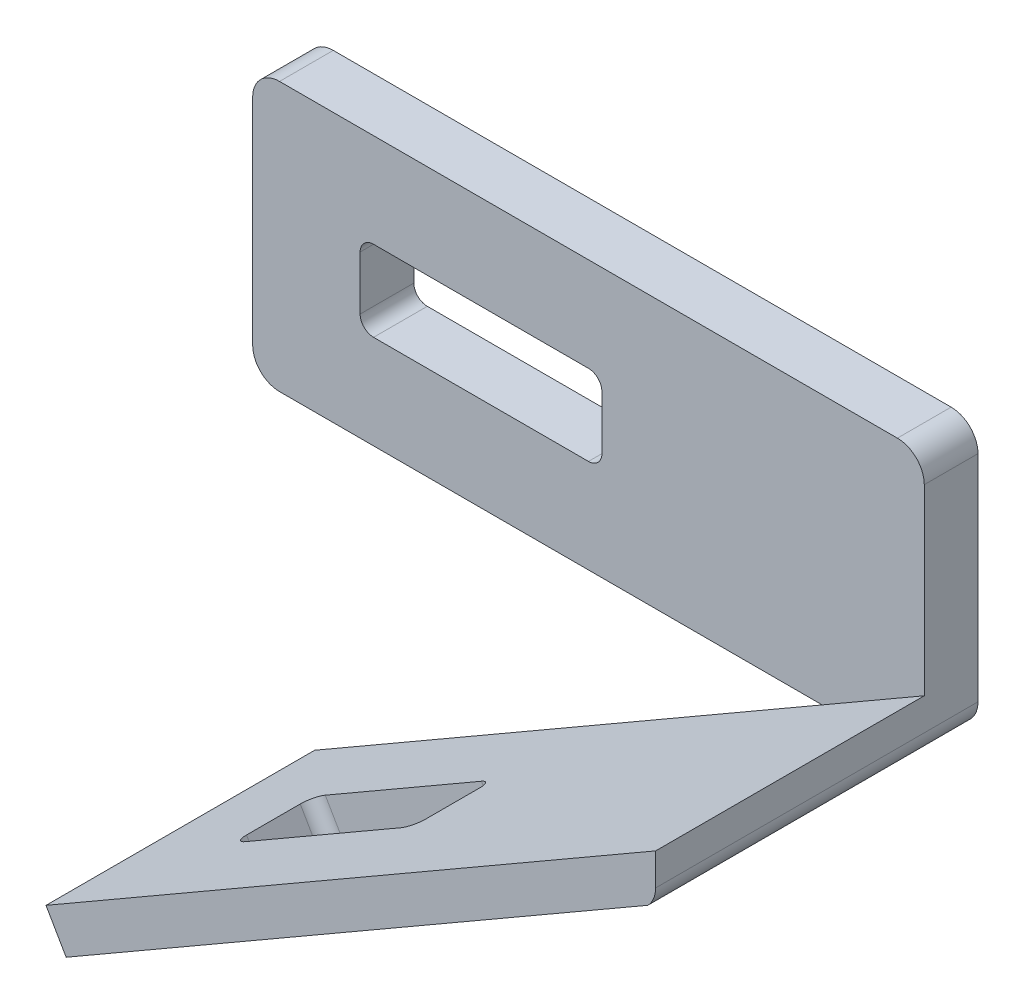
ISO-10303-21;
HEADER;
FILE_DESCRIPTION(('STEP AP214'),'2;1');
FILE_NAME('part.step','',(''),(''),'','','');
FILE_SCHEMA(('AUTOMOTIVE_DESIGN { 1 0 10303 214 1 1 1 1 }'));
ENDSEC;
DATA;
#1=APPLICATION_CONTEXT('core data for automotive mechanical design processes');
#2=APPLICATION_PROTOCOL_DEFINITION('international standard','automotive_design',2000,#1);
#3=PRODUCT_CONTEXT('',#1,'mechanical');
#4=PRODUCT('Part','Part','',(#3));
#5=PRODUCT_RELATED_PRODUCT_CATEGORY('part','',(#4));
#6=PRODUCT_DEFINITION_FORMATION('','',#4);
#7=PRODUCT_DEFINITION_CONTEXT('part definition',#1,'design');
#8=PRODUCT_DEFINITION('design','',#6,#7);
#9=PRODUCT_DEFINITION_SHAPE('','',#8);
#10=(LENGTH_UNIT() NAMED_UNIT(*) SI_UNIT(.MILLI.,.METRE.));
#11=(NAMED_UNIT(*) PLANE_ANGLE_UNIT() SI_UNIT($,.RADIAN.));
#12=(NAMED_UNIT(*) SI_UNIT($,.STERADIAN.) SOLID_ANGLE_UNIT());
#13=UNCERTAINTY_MEASURE_WITH_UNIT(LENGTH_MEASURE(1.E-05),#10,'distance_accuracy_value','');
#14=(GEOMETRIC_REPRESENTATION_CONTEXT(3) GLOBAL_UNCERTAINTY_ASSIGNED_CONTEXT((#13)) GLOBAL_UNIT_ASSIGNED_CONTEXT((#10,
#11,#12)) REPRESENTATION_CONTEXT('',''));
#15=CARTESIAN_POINT('',(0.,0.,0.));
#16=DIRECTION('',(0.,0.,1.));
#17=DIRECTION('',(1.,0.,0.));
#18=AXIS2_PLACEMENT_3D('',#15,#16,#17);
#19=CARTESIAN_POINT('',(34.7267267267267,6.70870870870871,4.));
#20=DIRECTION('',(0.,0.,-1.));
#21=DIRECTION('',(-1.,0.,0.));
#22=AXIS2_PLACEMENT_3D('',#19,#20,#21);
#23=PLANE('',#22);
#24=DIRECTION('',(0.,-1.,0.));
#25=VECTOR('',#24,1.);
#26=CARTESIAN_POINT('',(-5.27327327327327,0.708708708708703,4.));
#27=LINE('',#26,#25);
#28=CARTESIAN_POINT('',(-5.27327327327327,0.708708708708703,4.));
#29=VERTEX_POINT('',#28);
#30=CARTESIAN_POINT('',(-5.27327327327327,-3.29129129129128,4.));
#31=VERTEX_POINT('',#30);
#32=EDGE_CURVE('E318',#29,#31,#27,.T.);
#33=ORIENTED_EDGE('',*,*,#32,.F.);
#34=CARTESIAN_POINT('',(-4.27327327327327,0.708708708708711,4.));
#35=DIRECTION('',(0.,0.,1.));
#36=DIRECTION('',(-1.,0.,0.));
#37=AXIS2_PLACEMENT_3D('',#34,#35,#36);
#38=CIRCLE('',#37,1.);
#39=CARTESIAN_POINT('',(-4.27327327327327,1.70870870870871,4.));
#40=VERTEX_POINT('',#39);
#41=EDGE_CURVE('E316',#40,#29,#38,.T.);
#42=ORIENTED_EDGE('',*,*,#41,.F.);
#43=DIRECTION('',(-1.,0.,0.));
#44=VECTOR('',#43,1.);
#45=CARTESIAN_POINT('',(-4.27327327327327,1.70870870870871,4.));
#46=LINE('',#45,#44);
#47=CARTESIAN_POINT('',(11.7267267267267,1.70870870870871,4.));
#48=VERTEX_POINT('',#47);
#49=EDGE_CURVE('E336',#48,#40,#46,.T.);
#50=ORIENTED_EDGE('',*,*,#49,.F.);
#51=CARTESIAN_POINT('',(11.7267267267267,0.708708708708711,4.));
#52=DIRECTION('',(0.,0.,1.));
#53=DIRECTION('',(1.,0.,0.));
#54=AXIS2_PLACEMENT_3D('',#51,#52,#53);
#55=CIRCLE('',#54,1.);
#56=CARTESIAN_POINT('',(12.7267267267267,0.708708708708703,4.));
#57=VERTEX_POINT('',#56);
#58=EDGE_CURVE('E333',#57,#48,#55,.T.);
#59=ORIENTED_EDGE('',*,*,#58,.F.);
#60=DIRECTION('',(0.,1.,0.));
#61=VECTOR('',#60,1.);
#62=CARTESIAN_POINT('',(12.7267267267267,0.708708708708703,4.));
#63=LINE('',#62,#61);
#64=CARTESIAN_POINT('',(12.7267267267267,-3.29129129129129,4.));
#65=VERTEX_POINT('',#64);
#66=EDGE_CURVE('E330',#65,#57,#63,.T.);
#67=ORIENTED_EDGE('',*,*,#66,.F.);
#68=CARTESIAN_POINT('',(11.7267267267267,-3.29129129129129,4.));
#69=DIRECTION('',(0.,0.,1.));
#70=DIRECTION('',(1.,0.,0.));
#71=AXIS2_PLACEMENT_3D('',#68,#69,#70);
#72=CIRCLE('',#71,1.);
#73=CARTESIAN_POINT('',(11.7267267267267,-4.29129129129129,4.));
#74=VERTEX_POINT('',#73);
#75=EDGE_CURVE('E327',#74,#65,#72,.T.);
#76=ORIENTED_EDGE('',*,*,#75,.F.);
#77=DIRECTION('',(1.,0.,0.));
#78=VECTOR('',#77,1.);
#79=CARTESIAN_POINT('',(-4.27327327327327,-4.29129129129129,4.));
#80=LINE('',#79,#78);
#81=CARTESIAN_POINT('',(-4.27327327327327,-4.29129129129129,4.));
#82=VERTEX_POINT('',#81);
#83=EDGE_CURVE('E324',#82,#74,#80,.T.);
#84=ORIENTED_EDGE('',*,*,#83,.F.);
#85=CARTESIAN_POINT('',(-4.27327327327327,-3.29129129129129,4.));
#86=DIRECTION('',(0.,0.,1.));
#87=DIRECTION('',(1.,0.,0.));
#88=AXIS2_PLACEMENT_3D('',#85,#86,#87);
#89=CIRCLE('',#88,1.);
#90=EDGE_CURVE('E321',#31,#82,#89,.T.);
#91=ORIENTED_EDGE('',*,*,#90,.F.);
#92=EDGE_LOOP('',(#33,#42,#50,#59,#67,#76,#84,#91));
#93=FACE_BOUND('',#92,.T.);
#94=DIRECTION('',(-0.866022860763139,-0.500004404616229,0.));
#95=VECTOR('',#94,1.);
#96=CARTESIAN_POINT('',(-8.65940989064749,-33.1068499702216,4.));
#97=LINE('',#96,#95);
#98=CARTESIAN_POINT('',(36.7267267267267,-6.9028439960563,4.));
#99=VERTEX_POINT('',#98);
#100=CARTESIAN_POINT('',(29.1258023231814,-11.2912912912913,4.));
#101=VERTEX_POINT('',#100);
#102=EDGE_CURVE('E289',#99,#101,#97,.T.);
#103=ORIENTED_EDGE('',*,*,#102,.F.);
#104=DIRECTION('',(0.,1.,0.));
#105=VECTOR('',#104,1.);
#106=CARTESIAN_POINT('',(36.7267267267267,6.70870870870871,4.));
#107=LINE('',#106,#105);
#108=CARTESIAN_POINT('',(36.7267267267267,6.70870870870871,4.));
#109=VERTEX_POINT('',#108);
#110=EDGE_CURVE('E377',#99,#109,#107,.T.);
#111=ORIENTED_EDGE('',*,*,#110,.T.);
#112=CARTESIAN_POINT('',(34.7267267267267,6.70870870870871,4.));
#113=DIRECTION('',(0.,0.,1.));
#114=DIRECTION('',(-1.,0.,0.));
#115=AXIS2_PLACEMENT_3D('',#112,#113,#114);
#116=CIRCLE('',#115,2.);
#117=CARTESIAN_POINT('',(34.7267267267267,8.70870870870871,4.));
#118=VERTEX_POINT('',#117);
#119=EDGE_CURVE('E357',#109,#118,#116,.T.);
#120=ORIENTED_EDGE('',*,*,#119,.T.);
#121=DIRECTION('',(-1.,0.,0.));
#122=VECTOR('',#121,1.);
#123=CARTESIAN_POINT('',(-11.2732732732733,8.70870870870871,4.));
#124=LINE('',#123,#122);
#125=CARTESIAN_POINT('',(-11.2732732732733,8.70870870870871,4.));
#126=VERTEX_POINT('',#125);
#127=EDGE_CURVE('E360',#118,#126,#124,.T.);
#128=ORIENTED_EDGE('',*,*,#127,.T.);
#129=CARTESIAN_POINT('',(-11.2732732732733,6.70870870870871,4.));
#130=DIRECTION('',(0.,0.,1.));
#131=DIRECTION('',(-1.,0.,0.));
#132=AXIS2_PLACEMENT_3D('',#129,#130,#131);
#133=CIRCLE('',#132,2.);
#134=CARTESIAN_POINT('',(-13.2732732732733,6.7087087087087,4.));
#135=VERTEX_POINT('',#134);
#136=EDGE_CURVE('E363',#126,#135,#133,.T.);
#137=ORIENTED_EDGE('',*,*,#136,.T.);
#138=DIRECTION('',(0.,-1.,0.));
#139=VECTOR('',#138,1.);
#140=CARTESIAN_POINT('',(-13.2732732732733,6.7087087087087,4.));
#141=LINE('',#140,#139);
#142=CARTESIAN_POINT('',(-13.2732732732733,-9.29129129129128,4.));
#143=VERTEX_POINT('',#142);
#144=EDGE_CURVE('E365',#135,#143,#141,.T.);
#145=ORIENTED_EDGE('',*,*,#144,.T.);
#146=CARTESIAN_POINT('',(-11.2732732732733,-9.29129129129129,4.));
#147=DIRECTION('',(0.,0.,1.));
#148=DIRECTION('',(-1.,0.,0.));
#149=AXIS2_PLACEMENT_3D('',#146,#147,#148);
#150=CIRCLE('',#149,2.);
#151=CARTESIAN_POINT('',(-11.2732732732733,-11.2912912912913,4.));
#152=VERTEX_POINT('',#151);
#153=EDGE_CURVE('E367',#143,#152,#150,.T.);
#154=ORIENTED_EDGE('',*,*,#153,.T.);
#155=DIRECTION('',(1.,0.,0.));
#156=VECTOR('',#155,1.);
#157=CARTESIAN_POINT('',(-11.2732732732733,-11.2912912912913,4.));
#158=LINE('',#157,#156);
#159=EDGE_CURVE('E370',#152,#101,#158,.T.);
#160=ORIENTED_EDGE('',*,*,#159,.T.);
#161=EDGE_LOOP('',(#103,#111,#120,#128,#137,#145,#154,#160));
#162=FACE_BOUND('',#161,.T.);
#163=ADVANCED_FACE('F33',(#93,#162),#23,.F.);
#164=DIRECTION('',(0.866022860763139,0.500004404616229,0.));
#165=VECTOR('',#164,1.);
#166=CARTESIAN_POINT('',(36.1417463613581,-10.7046983216996,4.));
#167=LINE('',#166,#165);
#168=CARTESIAN_POINT('',(35.2432829574773,-11.2234325026091,4.));
#169=VERTEX_POINT('',#168);
#170=CARTESIAN_POINT('',(36.1417463613581,-10.7046983216996,4.));
#171=VERTEX_POINT('',#170);
#172=EDGE_CURVE('E11',#169,#171,#167,.T.);
#173=ORIENTED_EDGE('',*,*,#172,.F.);
#174=CARTESIAN_POINT('',(34.7267267267267,-9.29129129129129,4.));
#175=DIRECTION('',(0.,0.,1.));
#176=DIRECTION('',(-1.,0.,0.));
#177=AXIS2_PLACEMENT_3D('',#174,#175,#176);
#178=CIRCLE('',#177,2.);
#179=EDGE_CURVE('E373',#169,#171,#178,.T.);
#180=ORIENTED_EDGE('',*,*,#179,.T.);
#181=EDGE_LOOP('',(#173,#180));
#182=FACE_BOUND('',#181,.T.);
#183=ADVANCED_FACE('F484',(#182),#23,.F.);
#184=CARTESIAN_POINT('',(34.7267267267267,6.70870870870871,4.));
#185=DIRECTION('',(0.,0.,-1.));
#186=DIRECTION('',(-1.,0.,0.));
#187=AXIS2_PLACEMENT_3D('',#184,#185,#186);
#188=CYLINDRICAL_SURFACE('',#187,2.);
#189=CARTESIAN_POINT('',(34.7267267267267,6.70870870870871,0.));
#190=DIRECTION('',(0.,0.,1.));
#191=DIRECTION('',(-1.,0.,0.));
#192=AXIS2_PLACEMENT_3D('',#189,#190,#191);
#193=CIRCLE('',#192,2.);
#194=CARTESIAN_POINT('',(36.7267267267267,6.70870870870871,0.));
#195=VERTEX_POINT('',#194);
#196=CARTESIAN_POINT('',(34.7267267267267,8.70870870870871,0.));
#197=VERTEX_POINT('',#196);
#198=EDGE_CURVE('E342',#195,#197,#193,.T.);
#199=ORIENTED_EDGE('',*,*,#198,.T.);
#200=DIRECTION('',(0.,0.,-1.));
#201=VECTOR('',#200,1.);
#202=CARTESIAN_POINT('',(34.7267267267267,8.70870870870871,4.));
#203=LINE('',#202,#201);
#204=EDGE_CURVE('E415',#118,#197,#203,.T.);
#205=ORIENTED_EDGE('',*,*,#204,.F.);
#206=ORIENTED_EDGE('',*,*,#119,.F.);
#207=DIRECTION('',(0.,0.,-1.));
#208=VECTOR('',#207,1.);
#209=CARTESIAN_POINT('',(36.7267267267267,6.70870870870871,4.));
#210=LINE('',#209,#208);
#211=EDGE_CURVE('E379',#109,#195,#210,.T.);
#212=ORIENTED_EDGE('',*,*,#211,.T.);
#213=EDGE_LOOP('',(#199,#205,#206,#212));
#214=FACE_BOUND('',#213,.T.);
#215=ADVANCED_FACE('F35',(#214),#188,.T.);
#216=CARTESIAN_POINT('',(-11.2732732732733,8.70870870870871,4.));
#217=DIRECTION('',(0.,-1.,0.));
#218=DIRECTION('',(0.,0.,-1.));
#219=AXIS2_PLACEMENT_3D('',#216,#217,#218);
#220=PLANE('',#219);
#221=DIRECTION('',(-1.,0.,0.));
#222=VECTOR('',#221,1.);
#223=CARTESIAN_POINT('',(-11.2732732732733,8.70870870870871,0.));
#224=LINE('',#223,#222);
#225=CARTESIAN_POINT('',(-11.2732732732733,8.70870870870871,0.));
#226=VERTEX_POINT('',#225);
#227=EDGE_CURVE('E382',#197,#226,#224,.T.);
#228=ORIENTED_EDGE('',*,*,#227,.T.);
#229=DIRECTION('',(0.,0.,-1.));
#230=VECTOR('',#229,1.);
#231=CARTESIAN_POINT('',(-11.2732732732733,8.70870870870871,4.));
#232=LINE('',#231,#230);
#233=EDGE_CURVE('E412',#126,#226,#232,.T.);
#234=ORIENTED_EDGE('',*,*,#233,.F.);
#235=ORIENTED_EDGE('',*,*,#127,.F.);
#236=ORIENTED_EDGE('',*,*,#204,.T.);
#237=EDGE_LOOP('',(#228,#234,#235,#236));
#238=FACE_BOUND('',#237,.T.);
#239=ADVANCED_FACE('F517',(#238),#220,.F.);
#240=CARTESIAN_POINT('',(-11.2732732732733,6.70870870870871,4.));
#241=DIRECTION('',(0.,0.,-1.));
#242=DIRECTION('',(-1.,0.,0.));
#243=AXIS2_PLACEMENT_3D('',#240,#241,#242);
#244=CYLINDRICAL_SURFACE('',#243,2.);
#245=CARTESIAN_POINT('',(-11.2732732732733,6.70870870870871,0.));
#246=DIRECTION('',(0.,0.,1.));
#247=DIRECTION('',(-1.,0.,0.));
#248=AXIS2_PLACEMENT_3D('',#245,#246,#247);
#249=CIRCLE('',#248,2.);
#250=CARTESIAN_POINT('',(-13.2732732732733,6.7087087087087,0.));
#251=VERTEX_POINT('',#250);
#252=EDGE_CURVE('E384',#226,#251,#249,.T.);
#253=ORIENTED_EDGE('',*,*,#252,.T.);
#254=DIRECTION('',(0.,0.,-1.));
#255=VECTOR('',#254,1.);
#256=CARTESIAN_POINT('',(-13.2732732732733,6.7087087087087,4.));
#257=LINE('',#256,#255);
#258=EDGE_CURVE('E409',#135,#251,#257,.T.);
#259=ORIENTED_EDGE('',*,*,#258,.F.);
#260=ORIENTED_EDGE('',*,*,#136,.F.);
#261=ORIENTED_EDGE('',*,*,#233,.T.);
#262=EDGE_LOOP('',(#253,#259,#260,#261));
#263=FACE_BOUND('',#262,.T.);
#264=ADVANCED_FACE('F514',(#263),#244,.T.);
#265=CARTESIAN_POINT('',(-13.2732732732733,6.7087087087087,4.));
#266=DIRECTION('',(1.,0.,0.));
#267=DIRECTION('',(0.,0.,-1.));
#268=AXIS2_PLACEMENT_3D('',#265,#266,#267);
#269=PLANE('',#268);
#270=DIRECTION('',(0.,-1.,0.));
#271=VECTOR('',#270,1.);
#272=CARTESIAN_POINT('',(-13.2732732732733,6.7087087087087,0.));
#273=LINE('',#272,#271);
#274=CARTESIAN_POINT('',(-13.2732732732733,-9.29129129129128,0.));
#275=VERTEX_POINT('',#274);
#276=EDGE_CURVE('E386',#251,#275,#273,.T.);
#277=ORIENTED_EDGE('',*,*,#276,.T.);
#278=DIRECTION('',(0.,0.,-1.));
#279=VECTOR('',#278,1.);
#280=CARTESIAN_POINT('',(-13.2732732732733,-9.29129129129128,4.));
#281=LINE('',#280,#279);
#282=EDGE_CURVE('E406',#143,#275,#281,.T.);
#283=ORIENTED_EDGE('',*,*,#282,.F.);
#284=ORIENTED_EDGE('',*,*,#144,.F.);
#285=ORIENTED_EDGE('',*,*,#258,.T.);
#286=EDGE_LOOP('',(#277,#283,#284,#285));
#287=FACE_BOUND('',#286,.T.);
#288=ADVANCED_FACE('F510',(#287),#269,.F.);
#289=CARTESIAN_POINT('',(-11.2732732732733,-9.29129129129129,4.));
#290=DIRECTION('',(0.,0.,-1.));
#291=DIRECTION('',(-1.,0.,0.));
#292=AXIS2_PLACEMENT_3D('',#289,#290,#291);
#293=CYLINDRICAL_SURFACE('',#292,2.);
#294=CARTESIAN_POINT('',(-11.2732732732733,-9.29129129129129,0.));
#295=DIRECTION('',(0.,0.,1.));
#296=DIRECTION('',(-1.,0.,0.));
#297=AXIS2_PLACEMENT_3D('',#294,#295,#296);
#298=CIRCLE('',#297,2.);
#299=CARTESIAN_POINT('',(-11.2732732732733,-11.2912912912913,0.));
#300=VERTEX_POINT('',#299);
#301=EDGE_CURVE('E388',#275,#300,#298,.T.);
#302=ORIENTED_EDGE('',*,*,#301,.T.);
#303=DIRECTION('',(0.,0.,-1.));
#304=VECTOR('',#303,1.);
#305=CARTESIAN_POINT('',(-11.2732732732733,-11.2912912912913,4.));
#306=LINE('',#305,#304);
#307=EDGE_CURVE('E403',#152,#300,#306,.T.);
#308=ORIENTED_EDGE('',*,*,#307,.F.);
#309=ORIENTED_EDGE('',*,*,#153,.F.);
#310=ORIENTED_EDGE('',*,*,#282,.T.);
#311=EDGE_LOOP('',(#302,#308,#309,#310));
#312=FACE_BOUND('',#311,.T.);
#313=ADVANCED_FACE('F506',(#312),#293,.T.);
#314=CARTESIAN_POINT('',(-11.2732732732733,-11.2912912912913,4.));
#315=DIRECTION('',(0.,1.,0.));
#316=DIRECTION('',(0.,0.,1.));
#317=AXIS2_PLACEMENT_3D('',#314,#315,#316);
#318=PLANE('',#317);
#319=DIRECTION('',(1.,0.,0.));
#320=VECTOR('',#319,1.);
#321=CARTESIAN_POINT('',(-11.2732732732733,-11.2912912912913,0.));
#322=LINE('',#321,#320);
#323=CARTESIAN_POINT('',(34.7267267267267,-11.2912912912913,0.));
#324=VERTEX_POINT('',#323);
#325=EDGE_CURVE('E390',#300,#324,#322,.T.);
#326=ORIENTED_EDGE('',*,*,#325,.T.);
#327=DIRECTION('',(0.,0.,-1.));
#328=VECTOR('',#327,1.);
#329=CARTESIAN_POINT('',(34.7267267267267,-11.2912912912913,4.));
#330=LINE('',#329,#328);
#331=CARTESIAN_POINT('',(34.7267267267267,-11.2912912912913,4.));
#332=VERTEX_POINT('',#331);
#333=EDGE_CURVE('E400',#332,#324,#330,.T.);
#334=ORIENTED_EDGE('',*,*,#333,.F.);
#335=EDGE_CURVE('E369',#101,#332,#158,.T.);
#336=ORIENTED_EDGE('',*,*,#335,.F.);
#337=ORIENTED_EDGE('',*,*,#159,.F.);
#338=ORIENTED_EDGE('',*,*,#307,.T.);
#339=EDGE_LOOP('',(#326,#334,#336,#337,#338));
#340=FACE_BOUND('',#339,.T.);
#341=ADVANCED_FACE('F502',(#340),#318,.F.);
#342=CARTESIAN_POINT('',(34.7267267267267,-9.29129129129129,4.));
#343=DIRECTION('',(0.,0.,-1.));
#344=DIRECTION('',(-1.,0.,0.));
#345=AXIS2_PLACEMENT_3D('',#342,#343,#344);
#346=CYLINDRICAL_SURFACE('',#345,2.);
#347=CARTESIAN_POINT('',(34.7267267267267,-9.29129129129129,0.));
#348=DIRECTION('',(0.,0.,1.));
#349=DIRECTION('',(-1.,0.,0.));
#350=AXIS2_PLACEMENT_3D('',#347,#348,#349);
#351=CIRCLE('',#350,2.);
#352=CARTESIAN_POINT('',(36.7267267267267,-9.29129129129129,0.));
#353=VERTEX_POINT('',#352);
#354=EDGE_CURVE('E392',#324,#353,#351,.T.);
#355=ORIENTED_EDGE('',*,*,#354,.T.);
#356=DIRECTION('',(0.,0.,-1.));
#357=VECTOR('',#356,1.);
#358=CARTESIAN_POINT('',(36.7267267267267,-9.29129129129129,4.));
#359=LINE('',#358,#357);
#360=CARTESIAN_POINT('',(36.7267267267267,-9.29129129129129,24.));
#361=VERTEX_POINT('',#360);
#362=EDGE_CURVE('E397',#361,#353,#359,.T.);
#363=ORIENTED_EDGE('',*,*,#362,.F.);
#364=CARTESIAN_POINT('',(34.7267267267267,-9.29129129129129,24.));
#365=DIRECTION('',(0.,0.,1.));
#366=DIRECTION('',(-1.,0.,0.));
#367=AXIS2_PLACEMENT_3D('',#364,#365,#366);
#368=CIRCLE('',#367,2.);
#369=CARTESIAN_POINT('',(36.1417463613581,-10.7046983216996,24.));
#370=VERTEX_POINT('',#369);
#371=EDGE_CURVE('E291',#370,#361,#368,.T.);
#372=ORIENTED_EDGE('',*,*,#371,.F.);
#373=DIRECTION('',(0.,0.,-1.));
#374=VECTOR('',#373,1.);
#375=CARTESIAN_POINT('',(36.1417463613581,-10.7046983216996,24.));
#376=LINE('',#375,#374);
#377=EDGE_CURVE('E310',#370,#171,#376,.T.);
#378=ORIENTED_EDGE('',*,*,#377,.T.);
#379=ORIENTED_EDGE('',*,*,#179,.F.);
#380=EDGE_CURVE('E374',#332,#169,#178,.T.);
#381=ORIENTED_EDGE('',*,*,#380,.F.);
#382=ORIENTED_EDGE('',*,*,#333,.T.);
#383=EDGE_LOOP('',(#355,#363,#372,#378,#379,#381,#382));
#384=FACE_BOUND('',#383,.T.);
#385=ADVANCED_FACE('F498',(#384),#346,.T.);
#386=CARTESIAN_POINT('',(36.7267267267267,6.70870870870871,4.));
#387=DIRECTION('',(-1.,0.,0.));
#388=DIRECTION('',(0.,0.,1.));
#389=AXIS2_PLACEMENT_3D('',#386,#387,#388);
#390=PLANE('',#389);
#391=DIRECTION('',(0.,1.,0.));
#392=VECTOR('',#391,1.);
#393=CARTESIAN_POINT('',(36.7267267267267,6.70870870870871,0.));
#394=LINE('',#393,#392);
#395=EDGE_CURVE('E361',#353,#195,#394,.T.);
#396=ORIENTED_EDGE('',*,*,#395,.T.);
#397=ORIENTED_EDGE('',*,*,#211,.F.);
#398=ORIENTED_EDGE('',*,*,#110,.F.);
#399=DIRECTION('',(0.,0.,-1.));
#400=VECTOR('',#399,1.);
#401=CARTESIAN_POINT('',(36.7267267267267,-6.90284399605631,24.));
#402=LINE('',#401,#400);
#403=CARTESIAN_POINT('',(36.7267267267267,-6.90284399605631,24.));
#404=VERTEX_POINT('',#403);
#405=EDGE_CURVE('E307',#404,#99,#402,.T.);
#406=ORIENTED_EDGE('',*,*,#405,.F.);
#407=DIRECTION('',(0.,1.,0.));
#408=VECTOR('',#407,1.);
#409=CARTESIAN_POINT('',(36.7267267267267,-6.90284399605631,24.));
#410=LINE('',#409,#408);
#411=EDGE_CURVE('E294',#361,#404,#410,.T.);
#412=ORIENTED_EDGE('',*,*,#411,.F.);
#413=ORIENTED_EDGE('',*,*,#362,.T.);
#414=EDGE_LOOP('',(#396,#397,#398,#406,#412,#413));
#415=FACE_BOUND('',#414,.T.);
#416=ADVANCED_FACE('F495',(#415),#390,.F.);
#417=CARTESIAN_POINT('',(34.7267267267267,6.70870870870871,0.));
#418=DIRECTION('',(0.,0.,-1.));
#419=DIRECTION('',(-1.,0.,0.));
#420=AXIS2_PLACEMENT_3D('',#417,#418,#419);
#421=PLANE('',#420);
#422=CARTESIAN_POINT('',(-4.27327327327327,0.708708708708711,0.));
#423=DIRECTION('',(0.,0.,-1.));
#424=DIRECTION('',(-1.,0.,0.));
#425=AXIS2_PLACEMENT_3D('',#422,#423,#424);
#426=CIRCLE('',#425,1.);
#427=CARTESIAN_POINT('',(-5.27327327327327,0.708708708708703,0.));
#428=VERTEX_POINT('',#427);
#429=CARTESIAN_POINT('',(-4.27327327327327,1.70870870870871,0.));
#430=VERTEX_POINT('',#429);
#431=EDGE_CURVE('E37',#428,#430,#426,.T.);
#432=ORIENTED_EDGE('',*,*,#431,.F.);
#433=DIRECTION('',(0.,1.,0.));
#434=VECTOR('',#433,1.);
#435=CARTESIAN_POINT('',(-5.27327327327327,6.70870870870871,0.));
#436=LINE('',#435,#434);
#437=CARTESIAN_POINT('',(-5.27327327327327,-3.29129129129128,0.));
#438=VERTEX_POINT('',#437);
#439=EDGE_CURVE('E418',#438,#428,#436,.T.);
#440=ORIENTED_EDGE('',*,*,#439,.F.);
#441=CARTESIAN_POINT('',(-4.27327327327327,-3.29129129129129,0.));
#442=DIRECTION('',(0.,0.,-1.));
#443=DIRECTION('',(-1.,0.,0.));
#444=AXIS2_PLACEMENT_3D('',#441,#442,#443);
#445=CIRCLE('',#444,1.);
#446=CARTESIAN_POINT('',(-4.27327327327327,-4.29129129129129,0.));
#447=VERTEX_POINT('',#446);
#448=EDGE_CURVE('E420',#447,#438,#445,.T.);
#449=ORIENTED_EDGE('',*,*,#448,.F.);
#450=DIRECTION('',(-1.,0.,0.));
#451=VECTOR('',#450,1.);
#452=CARTESIAN_POINT('',(34.7267267267267,-4.29129129129129,0.));
#453=LINE('',#452,#451);
#454=CARTESIAN_POINT('',(11.7267267267267,-4.29129129129129,0.));
#455=VERTEX_POINT('',#454);
#456=EDGE_CURVE('E423',#455,#447,#453,.T.);
#457=ORIENTED_EDGE('',*,*,#456,.F.);
#458=CARTESIAN_POINT('',(11.7267267267267,-3.29129129129129,0.));
#459=DIRECTION('',(0.,0.,-1.));
#460=DIRECTION('',(-1.,0.,0.));
#461=AXIS2_PLACEMENT_3D('',#458,#459,#460);
#462=CIRCLE('',#461,1.);
#463=CARTESIAN_POINT('',(12.7267267267267,-3.29129129129129,0.));
#464=VERTEX_POINT('',#463);
#465=EDGE_CURVE('E425',#464,#455,#462,.T.);
#466=ORIENTED_EDGE('',*,*,#465,.F.);
#467=DIRECTION('',(0.,-1.,0.));
#468=VECTOR('',#467,1.);
#469=CARTESIAN_POINT('',(12.7267267267267,6.70870870870871,0.));
#470=LINE('',#469,#468);
#471=CARTESIAN_POINT('',(12.7267267267267,0.708708708708703,0.));
#472=VERTEX_POINT('',#471);
#473=EDGE_CURVE('E427',#472,#464,#470,.T.);
#474=ORIENTED_EDGE('',*,*,#473,.F.);
#475=CARTESIAN_POINT('',(11.7267267267267,0.708708708708711,0.));
#476=DIRECTION('',(0.,0.,-1.));
#477=DIRECTION('',(-1.,0.,0.));
#478=AXIS2_PLACEMENT_3D('',#475,#476,#477);
#479=CIRCLE('',#478,1.);
#480=CARTESIAN_POINT('',(11.7267267267267,1.70870870870871,0.));
#481=VERTEX_POINT('',#480);
#482=EDGE_CURVE('E429',#481,#472,#479,.T.);
#483=ORIENTED_EDGE('',*,*,#482,.F.);
#484=DIRECTION('',(1.,0.,0.));
#485=VECTOR('',#484,1.);
#486=CARTESIAN_POINT('',(34.7267267267267,1.70870870870871,0.));
#487=LINE('',#486,#485);
#488=EDGE_CURVE('E430',#430,#481,#487,.T.);
#489=ORIENTED_EDGE('',*,*,#488,.F.);
#490=EDGE_LOOP('',(#432,#440,#449,#457,#466,#474,#483,#489));
#491=FACE_BOUND('',#490,.T.);
#492=ORIENTED_EDGE('',*,*,#198,.F.);
#493=ORIENTED_EDGE('',*,*,#395,.F.);
#494=ORIENTED_EDGE('',*,*,#354,.F.);
#495=ORIENTED_EDGE('',*,*,#325,.F.);
#496=ORIENTED_EDGE('',*,*,#301,.F.);
#497=ORIENTED_EDGE('',*,*,#276,.F.);
#498=ORIENTED_EDGE('',*,*,#252,.F.);
#499=ORIENTED_EDGE('',*,*,#227,.F.);
#500=EDGE_LOOP('',(#492,#493,#494,#495,#496,#497,#498,#499));
#501=FACE_BOUND('',#500,.T.);
#502=ADVANCED_FACE('F445',(#491,#501),#421,.T.);
#503=CARTESIAN_POINT('',(-4.27327327327327,0.708708708708711,-46.));
#504=DIRECTION('',(0.,0.,1.));
#505=DIRECTION('',(1.,0.,0.));
#506=AXIS2_PLACEMENT_3D('',#503,#504,#505);
#507=CYLINDRICAL_SURFACE('',#506,1.);
#508=ORIENTED_EDGE('',*,*,#431,.T.);
#509=DIRECTION('',(0.,0.,1.));
#510=VECTOR('',#509,1.);
#511=CARTESIAN_POINT('',(-4.27327327327327,1.70870870870871,-46.));
#512=LINE('',#511,#510);
#513=EDGE_CURVE('E340',#430,#40,#512,.T.);
#514=ORIENTED_EDGE('',*,*,#513,.T.);
#515=ORIENTED_EDGE('',*,*,#41,.T.);
#516=DIRECTION('',(0.,0.,1.));
#517=VECTOR('',#516,1.);
#518=CARTESIAN_POINT('',(-5.27327327327327,0.708708708708703,-46.));
#519=LINE('',#518,#517);
#520=EDGE_CURVE('E339',#428,#29,#519,.T.);
#521=ORIENTED_EDGE('',*,*,#520,.F.);
#522=EDGE_LOOP('',(#508,#514,#515,#521));
#523=FACE_BOUND('',#522,.T.);
#524=ADVANCED_FACE('F438',(#523),#507,.F.);
#525=CARTESIAN_POINT('',(-4.27327327327327,1.70870870870871,-46.));
#526=DIRECTION('',(0.,1.,0.));
#527=DIRECTION('',(0.,0.,1.));
#528=AXIS2_PLACEMENT_3D('',#525,#526,#527);
#529=PLANE('',#528);
#530=ORIENTED_EDGE('',*,*,#488,.T.);
#531=DIRECTION('',(0.,0.,1.));
#532=VECTOR('',#531,1.);
#533=CARTESIAN_POINT('',(11.7267267267267,1.70870870870871,-46.));
#534=LINE('',#533,#532);
#535=EDGE_CURVE('E343',#481,#48,#534,.T.);
#536=ORIENTED_EDGE('',*,*,#535,.T.);
#537=ORIENTED_EDGE('',*,*,#49,.T.);
#538=ORIENTED_EDGE('',*,*,#513,.F.);
#539=EDGE_LOOP('',(#530,#536,#537,#538));
#540=FACE_BOUND('',#539,.T.);
#541=ADVANCED_FACE('F441',(#540),#529,.F.);
#542=CARTESIAN_POINT('',(11.7267267267267,0.708708708708711,-46.));
#543=DIRECTION('',(0.,0.,1.));
#544=DIRECTION('',(1.,0.,0.));
#545=AXIS2_PLACEMENT_3D('',#542,#543,#544);
#546=CYLINDRICAL_SURFACE('',#545,1.);
#547=ORIENTED_EDGE('',*,*,#482,.T.);
#548=DIRECTION('',(0.,0.,1.));
#549=VECTOR('',#548,1.);
#550=CARTESIAN_POINT('',(12.7267267267267,0.708708708708703,-46.));
#551=LINE('',#550,#549);
#552=EDGE_CURVE('E345',#472,#57,#551,.T.);
#553=ORIENTED_EDGE('',*,*,#552,.T.);
#554=ORIENTED_EDGE('',*,*,#58,.T.);
#555=ORIENTED_EDGE('',*,*,#535,.F.);
#556=EDGE_LOOP('',(#547,#553,#554,#555));
#557=FACE_BOUND('',#556,.T.);
#558=ADVANCED_FACE('F451',(#557),#546,.F.);
#559=CARTESIAN_POINT('',(12.7267267267267,0.708708708708703,-46.));
#560=DIRECTION('',(1.,0.,0.));
#561=DIRECTION('',(0.,0.,-1.));
#562=AXIS2_PLACEMENT_3D('',#559,#560,#561);
#563=PLANE('',#562);
#564=ORIENTED_EDGE('',*,*,#473,.T.);
#565=DIRECTION('',(0.,0.,1.));
#566=VECTOR('',#565,1.);
#567=CARTESIAN_POINT('',(12.7267267267267,-3.29129129129129,-46.));
#568=LINE('',#567,#566);
#569=EDGE_CURVE('E347',#464,#65,#568,.T.);
#570=ORIENTED_EDGE('',*,*,#569,.T.);
#571=ORIENTED_EDGE('',*,*,#66,.T.);
#572=ORIENTED_EDGE('',*,*,#552,.F.);
#573=EDGE_LOOP('',(#564,#570,#571,#572));
#574=FACE_BOUND('',#573,.T.);
#575=ADVANCED_FACE('F453',(#574),#563,.F.);
#576=CARTESIAN_POINT('',(11.7267267267267,-3.29129129129129,-46.));
#577=DIRECTION('',(0.,0.,1.));
#578=DIRECTION('',(1.,0.,0.));
#579=AXIS2_PLACEMENT_3D('',#576,#577,#578);
#580=CYLINDRICAL_SURFACE('',#579,1.);
#581=ORIENTED_EDGE('',*,*,#465,.T.);
#582=DIRECTION('',(0.,0.,1.));
#583=VECTOR('',#582,1.);
#584=CARTESIAN_POINT('',(11.7267267267267,-4.29129129129129,-46.));
#585=LINE('',#584,#583);
#586=EDGE_CURVE('E349',#455,#74,#585,.T.);
#587=ORIENTED_EDGE('',*,*,#586,.T.);
#588=ORIENTED_EDGE('',*,*,#75,.T.);
#589=ORIENTED_EDGE('',*,*,#569,.F.);
#590=EDGE_LOOP('',(#581,#587,#588,#589));
#591=FACE_BOUND('',#590,.T.);
#592=ADVANCED_FACE('F474',(#591),#580,.F.);
#593=CARTESIAN_POINT('',(-4.27327327327327,-4.29129129129129,-46.));
#594=DIRECTION('',(0.,-1.,0.));
#595=DIRECTION('',(0.,0.,-1.));
#596=AXIS2_PLACEMENT_3D('',#593,#594,#595);
#597=PLANE('',#596);
#598=ORIENTED_EDGE('',*,*,#456,.T.);
#599=DIRECTION('',(0.,0.,1.));
#600=VECTOR('',#599,1.);
#601=CARTESIAN_POINT('',(-4.27327327327327,-4.29129129129129,-46.));
#602=LINE('',#601,#600);
#603=EDGE_CURVE('E351',#447,#82,#602,.T.);
#604=ORIENTED_EDGE('',*,*,#603,.T.);
#605=ORIENTED_EDGE('',*,*,#83,.T.);
#606=ORIENTED_EDGE('',*,*,#586,.F.);
#607=EDGE_LOOP('',(#598,#604,#605,#606));
#608=FACE_BOUND('',#607,.T.);
#609=ADVANCED_FACE('F471',(#608),#597,.F.);
#610=CARTESIAN_POINT('',(-4.27327327327327,-3.29129129129129,-46.));
#611=DIRECTION('',(0.,0.,1.));
#612=DIRECTION('',(1.,0.,0.));
#613=AXIS2_PLACEMENT_3D('',#610,#611,#612);
#614=CYLINDRICAL_SURFACE('',#613,1.);
#615=ORIENTED_EDGE('',*,*,#448,.T.);
#616=DIRECTION('',(0.,0.,1.));
#617=VECTOR('',#616,1.);
#618=CARTESIAN_POINT('',(-5.27327327327327,-3.29129129129128,-46.));
#619=LINE('',#618,#617);
#620=EDGE_CURVE('E353',#438,#31,#619,.T.);
#621=ORIENTED_EDGE('',*,*,#620,.T.);
#622=ORIENTED_EDGE('',*,*,#90,.T.);
#623=ORIENTED_EDGE('',*,*,#603,.F.);
#624=EDGE_LOOP('',(#615,#621,#622,#623));
#625=FACE_BOUND('',#624,.T.);
#626=ADVANCED_FACE('F468',(#625),#614,.F.);
#627=CARTESIAN_POINT('',(-5.27327327327327,0.708708708708703,-46.));
#628=DIRECTION('',(-1.,0.,0.));
#629=DIRECTION('',(0.,0.,1.));
#630=AXIS2_PLACEMENT_3D('',#627,#628,#629);
#631=PLANE('',#630);
#632=ORIENTED_EDGE('',*,*,#439,.T.);
#633=ORIENTED_EDGE('',*,*,#520,.T.);
#634=ORIENTED_EDGE('',*,*,#32,.T.);
#635=ORIENTED_EDGE('',*,*,#620,.F.);
#636=EDGE_LOOP('',(#632,#633,#634,#635));
#637=FACE_BOUND('',#636,.T.);
#638=ADVANCED_FACE('F463',(#637),#631,.F.);
#639=CARTESIAN_POINT('',(-7.1593966767988,-35.704918552511,24.));
#640=DIRECTION('',(0.866022860763139,0.500004404616229,0.));
#641=DIRECTION('',(-0.500004404616229,0.866022860763139,0.));
#642=AXIS2_PLACEMENT_3D('',#639,#640,#641);
#643=PLANE('',#642);
#644=DIRECTION('',(0.500004404616229,-0.866022860763138,0.));
#645=VECTOR('',#644,1.);
#646=CARTESIAN_POINT('',(-7.1593966767988,-35.704918552511,4.));
#647=LINE('',#646,#645);
#648=CARTESIAN_POINT('',(-8.65940989064749,-33.1068499702216,4.));
#649=VERTEX_POINT('',#648);
#650=CARTESIAN_POINT('',(-7.1593966767988,-35.704918552511,4.));
#651=VERTEX_POINT('',#650);
#652=EDGE_CURVE('E240',#649,#651,#647,.T.);
#653=ORIENTED_EDGE('',*,*,#652,.T.);
#654=DIRECTION('',(0.,0.,-1.));
#655=VECTOR('',#654,1.);
#656=CARTESIAN_POINT('',(-7.1593966767988,-35.704918552511,24.));
#657=LINE('',#656,#655);
#658=CARTESIAN_POINT('',(-7.1593966767988,-35.704918552511,24.));
#659=VERTEX_POINT('',#658);
#660=EDGE_CURVE('E313',#659,#651,#657,.T.);
#661=ORIENTED_EDGE('',*,*,#660,.F.);
#662=DIRECTION('',(0.500004404616229,-0.866022860763138,0.));
#663=VECTOR('',#662,1.);
#664=CARTESIAN_POINT('',(-7.1593966767988,-35.704918552511,24.));
#665=LINE('',#664,#663);
#666=CARTESIAN_POINT('',(-8.65940989064749,-33.1068499702216,24.));
#667=VERTEX_POINT('',#666);
#668=EDGE_CURVE('E285',#667,#659,#665,.T.);
#669=ORIENTED_EDGE('',*,*,#668,.F.);
#670=DIRECTION('',(0.,0.,-1.));
#671=VECTOR('',#670,1.);
#672=CARTESIAN_POINT('',(-8.65940989064749,-33.1068499702216,24.));
#673=LINE('',#672,#671);
#674=EDGE_CURVE('E298',#667,#649,#673,.T.);
#675=ORIENTED_EDGE('',*,*,#674,.T.);
#676=EDGE_LOOP('',(#653,#661,#669,#675));
#677=FACE_BOUND('',#676,.T.);
#678=ADVANCED_FACE('F560',(#677),#643,.F.);
#679=CARTESIAN_POINT('',(36.1417463613581,-10.7046983216996,24.));
#680=DIRECTION('',(-0.500004404616229,0.866022860763139,0.));
#681=DIRECTION('',(-0.866022860763139,-0.500004404616229,0.));
#682=AXIS2_PLACEMENT_3D('',#679,#680,#681);
#683=PLANE('',#682);
#684=DIRECTION('',(0.866022860763139,0.500004404616229,0.));
#685=VECTOR('',#684,1.);
#686=CARTESIAN_POINT('',(0.634809070069452,-31.204878910965,11.));
#687=LINE('',#686,#685);
#688=CARTESIAN_POINT('',(0.634809070069448,-31.204878910965,11.));
#689=VERTEX_POINT('',#688);
#690=CARTESIAN_POINT('',(12.2570633384604,-24.4946884655944,11.));
#691=VERTEX_POINT('',#690);
#692=EDGE_CURVE('E247',#689,#691,#687,.T.);
#693=ORIENTED_EDGE('',*,*,#692,.F.);
#694=CARTESIAN_POINT('',(0.634809070069442,-31.204878910965,12.));
#695=DIRECTION('',(-0.500004404616229,0.866022860763139,0.));
#696=DIRECTION('',(-0.866022860763139,-0.500004404616229,0.));
#697=AXIS2_PLACEMENT_3D('',#694,#695,#696);
#698=CIRCLE('',#697,1.);
#699=CARTESIAN_POINT('',(-0.231213790693699,-31.7048833155812,12.));
#700=VERTEX_POINT('',#699);
#701=EDGE_CURVE('E228',#700,#689,#698,.F.);
#702=ORIENTED_EDGE('',*,*,#701,.F.);
#703=DIRECTION('',(0.,0.,-1.));
#704=VECTOR('',#703,1.);
#705=CARTESIAN_POINT('',(-0.231213790693699,-31.7048833155812,12.));
#706=LINE('',#705,#704);
#707=CARTESIAN_POINT('',(-0.231213790693699,-31.7048833155812,16.));
#708=VERTEX_POINT('',#707);
#709=EDGE_CURVE('E237',#708,#700,#706,.T.);
#710=ORIENTED_EDGE('',*,*,#709,.F.);
#711=CARTESIAN_POINT('',(0.634809070069443,-31.204878910965,16.));
#712=DIRECTION('',(-0.500004404616229,0.866022860763139,0.));
#713=DIRECTION('',(-0.866022860763139,-0.500004404616229,0.));
#714=AXIS2_PLACEMENT_3D('',#711,#712,#713);
#715=CIRCLE('',#714,1.);
#716=CARTESIAN_POINT('',(0.634809070069449,-31.204878910965,17.));
#717=VERTEX_POINT('',#716);
#718=EDGE_CURVE('E50',#717,#708,#715,.F.);
#719=ORIENTED_EDGE('',*,*,#718,.F.);
#720=DIRECTION('',(-0.866022860763139,-0.500004404616229,0.));
#721=VECTOR('',#720,1.);
#722=CARTESIAN_POINT('',(0.634809070069452,-31.204878910965,17.));
#723=LINE('',#722,#721);
#724=CARTESIAN_POINT('',(12.2570633384604,-24.4946884655944,17.));
#725=VERTEX_POINT('',#724);
#726=EDGE_CURVE('E756',#725,#717,#723,.T.);
#727=ORIENTED_EDGE('',*,*,#726,.F.);
#728=CARTESIAN_POINT('',(12.2570633384605,-24.4946884655944,16.));
#729=DIRECTION('',(-0.500004404616229,0.866022860763139,0.));
#730=DIRECTION('',(-0.866022860763139,-0.500004404616229,0.));
#731=AXIS2_PLACEMENT_3D('',#728,#729,#730);
#732=CIRCLE('',#731,1.);
#733=CARTESIAN_POINT('',(13.1230861992236,-23.9946840609782,16.));
#734=VERTEX_POINT('',#733);
#735=EDGE_CURVE('E759',#734,#725,#732,.F.);
#736=ORIENTED_EDGE('',*,*,#735,.F.);
#737=DIRECTION('',(0.,0.,1.));
#738=VECTOR('',#737,1.);
#739=CARTESIAN_POINT('',(13.1230861992236,-23.9946840609782,12.));
#740=LINE('',#739,#738);
#741=CARTESIAN_POINT('',(13.1230861992236,-23.9946840609782,12.));
#742=VERTEX_POINT('',#741);
#743=EDGE_CURVE('E764',#742,#734,#740,.T.);
#744=ORIENTED_EDGE('',*,*,#743,.F.);
#745=CARTESIAN_POINT('',(12.2570633384605,-24.4946884655944,12.));
#746=DIRECTION('',(-0.500004404616229,0.866022860763139,0.));
#747=DIRECTION('',(-0.866022860763139,-0.500004404616229,0.));
#748=AXIS2_PLACEMENT_3D('',#745,#746,#747);
#749=CIRCLE('',#748,1.);
#750=EDGE_CURVE('E251',#691,#742,#749,.F.);
#751=ORIENTED_EDGE('',*,*,#750,.F.);
#752=EDGE_LOOP('',(#693,#702,#710,#719,#727,#736,#744,#751));
#753=FACE_BOUND('',#752,.T.);
#754=EDGE_CURVE('E43',#651,#169,#167,.T.);
#755=ORIENTED_EDGE('',*,*,#754,.T.);
#756=ORIENTED_EDGE('',*,*,#172,.T.);
#757=ORIENTED_EDGE('',*,*,#377,.F.);
#758=DIRECTION('',(0.866022860763139,0.500004404616229,0.));
#759=VECTOR('',#758,1.);
#760=CARTESIAN_POINT('',(36.1417463613581,-10.7046983216996,24.));
#761=LINE('',#760,#759);
#762=EDGE_CURVE('E288',#659,#370,#761,.T.);
#763=ORIENTED_EDGE('',*,*,#762,.F.);
#764=ORIENTED_EDGE('',*,*,#660,.T.);
#765=EDGE_LOOP('',(#755,#756,#757,#763,#764));
#766=FACE_BOUND('',#765,.T.);
#767=ADVANCED_FACE('F243',(#753,#766),#683,.F.);
#768=CARTESIAN_POINT('',(-8.65940989064749,-33.1068499702216,24.));
#769=DIRECTION('',(0.500004404616229,-0.866022860763139,0.));
#770=DIRECTION('',(0.866022860763139,0.500004404616229,0.));
#771=AXIS2_PLACEMENT_3D('',#768,#769,#770);
#772=PLANE('',#771);
#773=DIRECTION('',(0.,0.,1.));
#774=VECTOR('',#773,1.);
#775=CARTESIAN_POINT('',(-1.73122700454238,-29.1068147332918,12.));
#776=LINE('',#775,#774);
#777=CARTESIAN_POINT('',(-1.73122700454238,-29.1068147332918,12.));
#778=VERTEX_POINT('',#777);
#779=CARTESIAN_POINT('',(-1.73122700454238,-29.1068147332918,16.));
#780=VERTEX_POINT('',#779);
#781=EDGE_CURVE('E249',#778,#780,#776,.T.);
#782=ORIENTED_EDGE('',*,*,#781,.F.);
#783=CARTESIAN_POINT('',(-0.865204143779242,-28.6068103286756,12.));
#784=DIRECTION('',(-0.500004404616229,0.866022860763139,0.));
#785=DIRECTION('',(-0.866022860763139,-0.500004404616229,0.));
#786=AXIS2_PLACEMENT_3D('',#783,#784,#785);
#787=CIRCLE('',#786,1.);
#788=CARTESIAN_POINT('',(-0.865204143779233,-28.6068103286756,11.));
#789=VERTEX_POINT('',#788);
#790=EDGE_CURVE('E58',#789,#778,#787,.T.);
#791=ORIENTED_EDGE('',*,*,#790,.F.);
#792=DIRECTION('',(-0.866022860763138,-0.500004404616229,0.));
#793=VECTOR('',#792,1.);
#794=CARTESIAN_POINT('',(-0.865204143779233,-28.6068103286756,11.));
#795=LINE('',#794,#793);
#796=CARTESIAN_POINT('',(10.7570501246118,-21.896619883305,11.));
#797=VERTEX_POINT('',#796);
#798=EDGE_CURVE('E234',#797,#789,#795,.T.);
#799=ORIENTED_EDGE('',*,*,#798,.F.);
#800=CARTESIAN_POINT('',(10.7570501246118,-21.896619883305,12.));
#801=DIRECTION('',(-0.500004404616229,0.866022860763139,0.));
#802=DIRECTION('',(0.866022860763139,0.500004404616229,0.));
#803=AXIS2_PLACEMENT_3D('',#800,#801,#802);
#804=CIRCLE('',#803,1.);
#805=CARTESIAN_POINT('',(11.6230729853749,-21.3966154786888,12.));
#806=VERTEX_POINT('',#805);
#807=EDGE_CURVE('E268',#806,#797,#804,.T.);
#808=ORIENTED_EDGE('',*,*,#807,.F.);
#809=DIRECTION('',(0.,0.,-1.));
#810=VECTOR('',#809,1.);
#811=CARTESIAN_POINT('',(11.6230729853749,-21.3966154786888,12.));
#812=LINE('',#811,#810);
#813=CARTESIAN_POINT('',(11.6230729853749,-21.3966154786888,16.));
#814=VERTEX_POINT('',#813);
#815=EDGE_CURVE('E265',#814,#806,#812,.T.);
#816=ORIENTED_EDGE('',*,*,#815,.F.);
#817=CARTESIAN_POINT('',(10.7570501246118,-21.896619883305,16.));
#818=DIRECTION('',(-0.500004404616229,0.866022860763139,0.));
#819=DIRECTION('',(-0.866022860763139,-0.500004404616229,0.));
#820=AXIS2_PLACEMENT_3D('',#817,#818,#819);
#821=CIRCLE('',#820,1.);
#822=CARTESIAN_POINT('',(10.7570501246118,-21.896619883305,17.));
#823=VERTEX_POINT('',#822);
#824=EDGE_CURVE('E262',#823,#814,#821,.T.);
#825=ORIENTED_EDGE('',*,*,#824,.F.);
#826=DIRECTION('',(0.866022860763138,0.500004404616229,0.));
#827=VECTOR('',#826,1.);
#828=CARTESIAN_POINT('',(-0.865204143779233,-28.6068103286756,17.));
#829=LINE('',#828,#827);
#830=CARTESIAN_POINT('',(-0.865204143779233,-28.6068103286756,17.));
#831=VERTEX_POINT('',#830);
#832=EDGE_CURVE('E259',#831,#823,#829,.T.);
#833=ORIENTED_EDGE('',*,*,#832,.F.);
#834=CARTESIAN_POINT('',(-0.86520414377924,-28.6068103286756,16.));
#835=DIRECTION('',(-0.500004404616229,0.866022860763139,0.));
#836=DIRECTION('',(-0.866022860763139,-0.500004404616229,0.));
#837=AXIS2_PLACEMENT_3D('',#834,#835,#836);
#838=CIRCLE('',#837,1.);
#839=EDGE_CURVE('E256',#780,#831,#838,.T.);
#840=ORIENTED_EDGE('',*,*,#839,.F.);
#841=EDGE_LOOP('',(#782,#791,#799,#808,#816,#825,#833,#840));
#842=FACE_BOUND('',#841,.T.);
#843=ORIENTED_EDGE('',*,*,#102,.T.);
#844=EDGE_CURVE('E302',#101,#649,#97,.T.);
#845=ORIENTED_EDGE('',*,*,#844,.T.);
#846=ORIENTED_EDGE('',*,*,#674,.F.);
#847=DIRECTION('',(-0.866022860763139,-0.500004404616229,0.));
#848=VECTOR('',#847,1.);
#849=CARTESIAN_POINT('',(-8.65940989064749,-33.1068499702216,24.));
#850=LINE('',#849,#848);
#851=EDGE_CURVE('E296',#404,#667,#850,.T.);
#852=ORIENTED_EDGE('',*,*,#851,.F.);
#853=ORIENTED_EDGE('',*,*,#405,.T.);
#854=EDGE_LOOP('',(#843,#845,#846,#852,#853));
#855=FACE_BOUND('',#854,.T.);
#856=ADVANCED_FACE('F563',(#842,#855),#772,.F.);
#857=CARTESIAN_POINT('',(34.7267267267267,-9.29129129129129,24.));
#858=DIRECTION('',(0.,0.,-1.));
#859=DIRECTION('',(-1.,0.,0.));
#860=AXIS2_PLACEMENT_3D('',#857,#858,#859);
#861=PLANE('',#860);
#862=ORIENTED_EDGE('',*,*,#668,.T.);
#863=ORIENTED_EDGE('',*,*,#762,.T.);
#864=ORIENTED_EDGE('',*,*,#371,.T.);
#865=ORIENTED_EDGE('',*,*,#411,.T.);
#866=ORIENTED_EDGE('',*,*,#851,.T.);
#867=EDGE_LOOP('',(#862,#863,#864,#865,#866));
#868=FACE_BOUND('',#867,.T.);
#869=ADVANCED_FACE('F549',(#868),#861,.F.);
#870=CARTESIAN_POINT('',(34.7267267267267,-9.29129129129129,4.));
#871=DIRECTION('',(0.,0.,-1.));
#872=DIRECTION('',(-1.,0.,0.));
#873=AXIS2_PLACEMENT_3D('',#870,#871,#872);
#874=PLANE('',#873);
#875=ORIENTED_EDGE('',*,*,#844,.F.);
#876=ORIENTED_EDGE('',*,*,#335,.T.);
#877=ORIENTED_EDGE('',*,*,#380,.T.);
#878=ORIENTED_EDGE('',*,*,#754,.F.);
#879=ORIENTED_EDGE('',*,*,#652,.F.);
#880=EDGE_LOOP('',(#875,#876,#877,#878,#879));
#881=FACE_BOUND('',#880,.T.);
#882=ADVANCED_FACE('F557',(#881),#874,.T.);
#883=CARTESIAN_POINT('',(11.6072162429831,-50.2094223942131,12.));
#884=DIRECTION('',(-0.500004404616229,0.866022860763139,0.));
#885=DIRECTION('',(-0.866022860763139,-0.500004404616229,0.));
#886=AXIS2_PLACEMENT_3D('',#883,#884,#885);
#887=CYLINDRICAL_SURFACE('',#886,1.);
#888=ORIENTED_EDGE('',*,*,#701,.T.);
#889=DIRECTION('',(-0.500004404616229,0.866022860763139,0.));
#890=VECTOR('',#889,1.);
#891=CARTESIAN_POINT('',(11.6072162429831,-50.2094223942131,11.));
#892=LINE('',#891,#890);
#893=EDGE_CURVE('E241',#689,#789,#892,.T.);
#894=ORIENTED_EDGE('',*,*,#893,.T.);
#895=ORIENTED_EDGE('',*,*,#790,.T.);
#896=DIRECTION('',(-0.500004404616229,0.866022860763139,0.));
#897=VECTOR('',#896,1.);
#898=CARTESIAN_POINT('',(10.74119338222,-50.7094267988293,12.));
#899=LINE('',#898,#897);
#900=EDGE_CURVE('E224',#700,#778,#899,.T.);
#901=ORIENTED_EDGE('',*,*,#900,.F.);
#902=EDGE_LOOP('',(#888,#894,#895,#901));
#903=FACE_BOUND('',#902,.T.);
#904=ADVANCED_FACE('F226',(#903),#887,.F.);
#905=CARTESIAN_POINT('',(11.6072162429831,-50.2094223942131,11.));
#906=DIRECTION('',(0.,0.,-1.));
#907=DIRECTION('',(-1.,0.,0.));
#908=AXIS2_PLACEMENT_3D('',#905,#906,#907);
#909=PLANE('',#908);
#910=ORIENTED_EDGE('',*,*,#692,.T.);
#911=DIRECTION('',(-0.500004404616229,0.866022860763139,0.));
#912=VECTOR('',#911,1.);
#913=CARTESIAN_POINT('',(23.2294705113741,-43.4992319488425,11.));
#914=LINE('',#913,#912);
#915=EDGE_CURVE('E274',#691,#797,#914,.T.);
#916=ORIENTED_EDGE('',*,*,#915,.T.);
#917=ORIENTED_EDGE('',*,*,#798,.T.);
#918=ORIENTED_EDGE('',*,*,#893,.F.);
#919=EDGE_LOOP('',(#910,#916,#917,#918));
#920=FACE_BOUND('',#919,.T.);
#921=ADVANCED_FACE('F684',(#920),#909,.F.);
#922=CARTESIAN_POINT('',(23.2294705113741,-43.4992319488425,12.));
#923=DIRECTION('',(-0.500004404616229,0.866022860763139,0.));
#924=DIRECTION('',(-0.866022860763139,-0.500004404616229,0.));
#925=AXIS2_PLACEMENT_3D('',#922,#923,#924);
#926=CYLINDRICAL_SURFACE('',#925,1.);
#927=ORIENTED_EDGE('',*,*,#750,.T.);
#928=DIRECTION('',(-0.500004404616229,0.866022860763139,0.));
#929=VECTOR('',#928,1.);
#930=CARTESIAN_POINT('',(24.0954933721373,-42.9992275442263,12.));
#931=LINE('',#930,#929);
#932=EDGE_CURVE('E276',#742,#806,#931,.T.);
#933=ORIENTED_EDGE('',*,*,#932,.T.);
#934=ORIENTED_EDGE('',*,*,#807,.T.);
#935=ORIENTED_EDGE('',*,*,#915,.F.);
#936=EDGE_LOOP('',(#927,#933,#934,#935));
#937=FACE_BOUND('',#936,.T.);
#938=ADVANCED_FACE('F693',(#937),#926,.F.);
#939=CARTESIAN_POINT('',(24.0954933721373,-42.9992275442263,12.));
#940=DIRECTION('',(0.866022860763139,0.500004404616229,0.));
#941=DIRECTION('',(-0.500004404616229,0.866022860763139,0.));
#942=AXIS2_PLACEMENT_3D('',#939,#940,#941);
#943=PLANE('',#942);
#944=ORIENTED_EDGE('',*,*,#743,.T.);
#945=DIRECTION('',(-0.500004404616229,0.866022860763139,0.));
#946=VECTOR('',#945,1.);
#947=CARTESIAN_POINT('',(24.0954933721373,-42.9992275442263,16.));
#948=LINE('',#947,#946);
#949=EDGE_CURVE('E278',#734,#814,#948,.T.);
#950=ORIENTED_EDGE('',*,*,#949,.T.);
#951=ORIENTED_EDGE('',*,*,#815,.T.);
#952=ORIENTED_EDGE('',*,*,#932,.F.);
#953=EDGE_LOOP('',(#944,#950,#951,#952));
#954=FACE_BOUND('',#953,.T.);
#955=ADVANCED_FACE('F703',(#954),#943,.F.);
#956=CARTESIAN_POINT('',(23.2294705113741,-43.4992319488425,16.));
#957=DIRECTION('',(-0.500004404616229,0.866022860763139,0.));
#958=DIRECTION('',(-0.866022860763139,-0.500004404616229,0.));
#959=AXIS2_PLACEMENT_3D('',#956,#957,#958);
#960=CYLINDRICAL_SURFACE('',#959,1.);
#961=ORIENTED_EDGE('',*,*,#735,.T.);
#962=DIRECTION('',(-0.500004404616229,0.866022860763139,0.));
#963=VECTOR('',#962,1.);
#964=CARTESIAN_POINT('',(23.2294705113741,-43.4992319488425,17.));
#965=LINE('',#964,#963);
#966=EDGE_CURVE('E280',#725,#823,#965,.T.);
#967=ORIENTED_EDGE('',*,*,#966,.T.);
#968=ORIENTED_EDGE('',*,*,#824,.T.);
#969=ORIENTED_EDGE('',*,*,#949,.F.);
#970=EDGE_LOOP('',(#961,#967,#968,#969));
#971=FACE_BOUND('',#970,.T.);
#972=ADVANCED_FACE('F713',(#971),#960,.F.);
#973=CARTESIAN_POINT('',(11.6072162429831,-50.2094223942131,17.));
#974=DIRECTION('',(0.,0.,1.));
#975=DIRECTION('',(1.,0.,0.));
#976=AXIS2_PLACEMENT_3D('',#973,#974,#975);
#977=PLANE('',#976);
#978=ORIENTED_EDGE('',*,*,#726,.T.);
#979=DIRECTION('',(-0.500004404616229,0.866022860763139,0.));
#980=VECTOR('',#979,1.);
#981=CARTESIAN_POINT('',(11.6072162429831,-50.2094223942131,17.));
#982=LINE('',#981,#980);
#983=EDGE_CURVE('E282',#717,#831,#982,.T.);
#984=ORIENTED_EDGE('',*,*,#983,.T.);
#985=ORIENTED_EDGE('',*,*,#832,.T.);
#986=ORIENTED_EDGE('',*,*,#966,.F.);
#987=EDGE_LOOP('',(#978,#984,#985,#986));
#988=FACE_BOUND('',#987,.T.);
#989=ADVANCED_FACE('F723',(#988),#977,.F.);
#990=CARTESIAN_POINT('',(11.6072162429831,-50.2094223942131,16.));
#991=DIRECTION('',(-0.500004404616229,0.866022860763139,0.));
#992=DIRECTION('',(-0.866022860763139,-0.500004404616229,0.));
#993=AXIS2_PLACEMENT_3D('',#990,#991,#992);
#994=CYLINDRICAL_SURFACE('',#993,1.);
#995=ORIENTED_EDGE('',*,*,#718,.T.);
#996=DIRECTION('',(-0.500004404616229,0.866022860763139,0.));
#997=VECTOR('',#996,1.);
#998=CARTESIAN_POINT('',(10.74119338222,-50.7094267988293,16.));
#999=LINE('',#998,#997);
#1000=EDGE_CURVE('E233',#708,#780,#999,.T.);
#1001=ORIENTED_EDGE('',*,*,#1000,.T.);
#1002=ORIENTED_EDGE('',*,*,#839,.T.);
#1003=ORIENTED_EDGE('',*,*,#983,.F.);
#1004=EDGE_LOOP('',(#995,#1001,#1002,#1003));
#1005=FACE_BOUND('',#1004,.T.);
#1006=ADVANCED_FACE('F733',(#1005),#994,.F.);
#1007=CARTESIAN_POINT('',(10.74119338222,-50.7094267988293,12.));
#1008=DIRECTION('',(-0.866022860763139,-0.500004404616229,0.));
#1009=DIRECTION('',(0.500004404616229,-0.866022860763139,0.));
#1010=AXIS2_PLACEMENT_3D('',#1007,#1008,#1009);
#1011=PLANE('',#1010);
#1012=ORIENTED_EDGE('',*,*,#709,.T.);
#1013=ORIENTED_EDGE('',*,*,#900,.T.);
#1014=ORIENTED_EDGE('',*,*,#781,.T.);
#1015=ORIENTED_EDGE('',*,*,#1000,.F.);
#1016=EDGE_LOOP('',(#1012,#1013,#1014,#1015));
#1017=FACE_BOUND('',#1016,.T.);
#1018=ADVANCED_FACE('F238',(#1017),#1011,.F.);
#1019=CLOSED_SHELL('',(#163,#183,#215,#239,#264,#288,#313,#341,#385,#416,#502,#524,#541,#558,
#575,#592,#609,#626,#638,#678,#767,#856,#869,#882,#904,#921,#938,#955,#972,#989,#1006,#1018));
#1020=MANIFOLD_SOLID_BREP('B2',#1019);
#1021=ADVANCED_BREP_SHAPE_REPRESENTATION('',(#18,#1020),#14);
#1022=SHAPE_DEFINITION_REPRESENTATION(#9,#1021);
ENDSEC;
END-ISO-10303-21;
